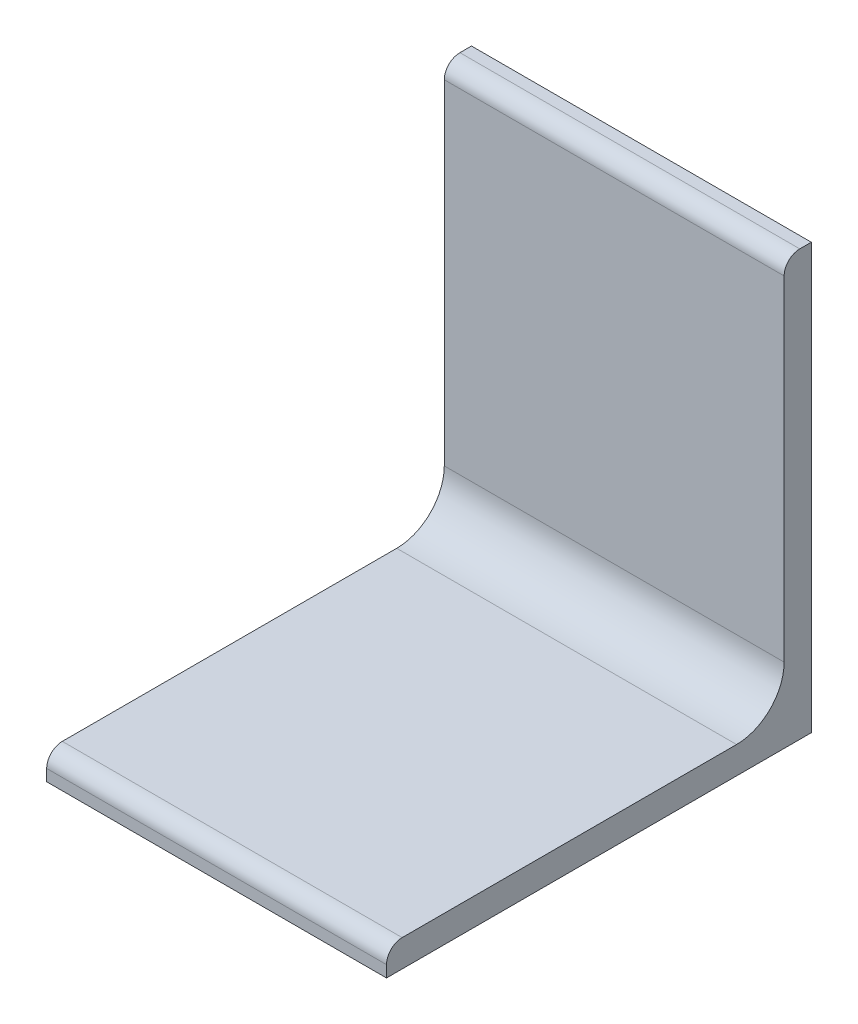
ISO-10303-21;
HEADER;
FILE_DESCRIPTION(('STEP AP214'),'2;1');
FILE_NAME('part.step','',(''),(''),'','','');
FILE_SCHEMA(('AUTOMOTIVE_DESIGN { 1 0 10303 214 1 1 1 1 }'));
ENDSEC;
DATA;
#1=APPLICATION_CONTEXT('core data for automotive mechanical design processes');
#2=APPLICATION_PROTOCOL_DEFINITION('international standard','automotive_design',2000,#1);
#3=PRODUCT_CONTEXT('',#1,'mechanical');
#4=PRODUCT('Part','Part','',(#3));
#5=PRODUCT_RELATED_PRODUCT_CATEGORY('part','',(#4));
#6=PRODUCT_DEFINITION_FORMATION('','',#4);
#7=PRODUCT_DEFINITION_CONTEXT('part definition',#1,'design');
#8=PRODUCT_DEFINITION('design','',#6,#7);
#9=PRODUCT_DEFINITION_SHAPE('','',#8);
#10=(LENGTH_UNIT() NAMED_UNIT(*) SI_UNIT(.MILLI.,.METRE.));
#11=(NAMED_UNIT(*) PLANE_ANGLE_UNIT() SI_UNIT($,.RADIAN.));
#12=(NAMED_UNIT(*) SI_UNIT($,.STERADIAN.) SOLID_ANGLE_UNIT());
#13=UNCERTAINTY_MEASURE_WITH_UNIT(LENGTH_MEASURE(1.E-05),#10,'distance_accuracy_value','');
#14=(GEOMETRIC_REPRESENTATION_CONTEXT(3) GLOBAL_UNCERTAINTY_ASSIGNED_CONTEXT((#13)) GLOBAL_UNIT_ASSIGNED_CONTEXT((#10,
#11,#12)) REPRESENTATION_CONTEXT('',''));
#15=CARTESIAN_POINT('',(0.,0.,0.));
#16=DIRECTION('',(0.,0.,1.));
#17=DIRECTION('',(1.,0.,0.));
#18=AXIS2_PLACEMENT_3D('',#15,#16,#17);
#19=CARTESIAN_POINT('',(100.,91.4,-33.6));
#20=DIRECTION('',(0.,0.,1.));
#21=DIRECTION('',(0.,-1.,0.));
#22=AXIS2_PLACEMENT_3D('',#19,#20,#21);
#23=PLANE('',#22);
#24=DIRECTION('',(0.,1.,0.));
#25=VECTOR('',#24,1.);
#26=CARTESIAN_POINT('',(0.,91.4,-33.6));
#27=LINE('',#26,#25);
#28=CARTESIAN_POINT('',(0.,-33.6,-33.6));
#29=VERTEX_POINT('',#28);
#30=CARTESIAN_POINT('',(0.,91.4,-33.6));
#31=VERTEX_POINT('',#30);
#32=EDGE_CURVE('E168',#29,#31,#27,.T.);
#33=ORIENTED_EDGE('',*,*,#32,.T.);
#34=DIRECTION('',(-1.,0.,0.));
#35=VECTOR('',#34,1.);
#36=CARTESIAN_POINT('',(100.,91.4,-33.6));
#37=LINE('',#36,#35);
#38=CARTESIAN_POINT('',(100.,91.4,-33.6));
#39=VERTEX_POINT('',#38);
#40=EDGE_CURVE('E13',#39,#31,#37,.T.);
#41=ORIENTED_EDGE('',*,*,#40,.F.);
#42=DIRECTION('',(0.,1.,0.));
#43=VECTOR('',#42,1.);
#44=CARTESIAN_POINT('',(100.,91.4,-33.6));
#45=LINE('',#44,#43);
#46=CARTESIAN_POINT('',(100.,-33.6,-33.6));
#47=VERTEX_POINT('',#46);
#48=EDGE_CURVE('E184',#47,#39,#45,.T.);
#49=ORIENTED_EDGE('',*,*,#48,.F.);
#50=DIRECTION('',(-1.,0.,0.));
#51=VECTOR('',#50,1.);
#52=CARTESIAN_POINT('',(100.,-33.6,-33.6));
#53=LINE('',#52,#51);
#54=EDGE_CURVE('E164',#47,#29,#53,.T.);
#55=ORIENTED_EDGE('',*,*,#54,.T.);
#56=EDGE_LOOP('',(#33,#41,#49,#55));
#57=FACE_BOUND('',#56,.T.);
#58=ADVANCED_FACE('F66',(#57),#23,.F.);
#59=CARTESIAN_POINT('',(100.,91.4,-33.6));
#60=DIRECTION('',(0.,-1.,0.));
#61=DIRECTION('',(0.,0.,-1.));
#62=AXIS2_PLACEMENT_3D('',#59,#60,#61);
#63=PLANE('',#62);
#64=DIRECTION('',(0.,0.,1.));
#65=VECTOR('',#64,1.);
#66=CARTESIAN_POINT('',(0.,91.4,-33.6));
#67=LINE('',#66,#65);
#68=CARTESIAN_POINT('',(0.,91.4,-30.2));
#69=VERTEX_POINT('',#68);
#70=EDGE_CURVE('E171',#31,#69,#67,.T.);
#71=ORIENTED_EDGE('',*,*,#70,.T.);
#72=DIRECTION('',(-1.,0.,0.));
#73=VECTOR('',#72,1.);
#74=CARTESIAN_POINT('',(100.,91.4,-30.2));
#75=LINE('',#74,#73);
#76=CARTESIAN_POINT('',(100.,91.4,-30.2));
#77=VERTEX_POINT('',#76);
#78=EDGE_CURVE('E74',#77,#69,#75,.T.);
#79=ORIENTED_EDGE('',*,*,#78,.F.);
#80=DIRECTION('',(0.,0.,1.));
#81=VECTOR('',#80,1.);
#82=CARTESIAN_POINT('',(100.,91.4,-33.6));
#83=LINE('',#82,#81);
#84=EDGE_CURVE('E128',#39,#77,#83,.T.);
#85=ORIENTED_EDGE('',*,*,#84,.F.);
#86=ORIENTED_EDGE('',*,*,#40,.T.);
#87=EDGE_LOOP('',(#71,#79,#85,#86));
#88=FACE_BOUND('',#87,.T.);
#89=ADVANCED_FACE('F227',(#88),#63,.F.);
#90=CARTESIAN_POINT('',(100.,86.8,-30.2));
#91=DIRECTION('',(-1.,0.,0.));
#92=DIRECTION('',(0.,0.,1.));
#93=AXIS2_PLACEMENT_3D('',#90,#91,#92);
#94=CYLINDRICAL_SURFACE('',#93,4.60000000000001);
#95=CARTESIAN_POINT('',(0.,86.8,-30.2));
#96=DIRECTION('',(1.,0.,0.));
#97=DIRECTION('',(0.,0.,1.));
#98=AXIS2_PLACEMENT_3D('',#95,#96,#97);
#99=CIRCLE('',#98,4.60000000000001);
#100=CARTESIAN_POINT('',(0.,86.8,-25.6));
#101=VERTEX_POINT('',#100);
#102=EDGE_CURVE('E173',#69,#101,#99,.T.);
#103=ORIENTED_EDGE('',*,*,#102,.T.);
#104=DIRECTION('',(-1.,0.,0.));
#105=VECTOR('',#104,1.);
#106=CARTESIAN_POINT('',(100.,86.8,-25.6));
#107=LINE('',#106,#105);
#108=CARTESIAN_POINT('',(100.,86.8,-25.6));
#109=VERTEX_POINT('',#108);
#110=EDGE_CURVE('E194',#109,#101,#107,.T.);
#111=ORIENTED_EDGE('',*,*,#110,.F.);
#112=CARTESIAN_POINT('',(100.,86.8,-30.2));
#113=DIRECTION('',(1.,0.,0.));
#114=DIRECTION('',(0.,0.,1.));
#115=AXIS2_PLACEMENT_3D('',#112,#113,#114);
#116=CIRCLE('',#115,4.60000000000001);
#117=EDGE_CURVE('E202',#77,#109,#116,.T.);
#118=ORIENTED_EDGE('',*,*,#117,.F.);
#119=ORIENTED_EDGE('',*,*,#78,.T.);
#120=EDGE_LOOP('',(#103,#111,#118,#119));
#121=FACE_BOUND('',#120,.T.);
#122=ADVANCED_FACE('F200',(#121),#94,.T.);
#123=CARTESIAN_POINT('',(100.,-11.6,-25.6));
#124=DIRECTION('',(0.,0.,-1.));
#125=DIRECTION('',(-1.,0.,0.));
#126=AXIS2_PLACEMENT_3D('',#123,#124,#125);
#127=PLANE('',#126);
#128=DIRECTION('',(0.,-1.,0.));
#129=VECTOR('',#128,1.);
#130=CARTESIAN_POINT('',(0.,-11.6,-25.6));
#131=LINE('',#130,#129);
#132=CARTESIAN_POINT('',(0.,-11.6,-25.6));
#133=VERTEX_POINT('',#132);
#134=EDGE_CURVE('E175',#101,#133,#131,.T.);
#135=ORIENTED_EDGE('',*,*,#134,.T.);
#136=DIRECTION('',(-1.,0.,0.));
#137=VECTOR('',#136,1.);
#138=CARTESIAN_POINT('',(100.,-11.6,-25.6));
#139=LINE('',#138,#137);
#140=CARTESIAN_POINT('',(100.,-11.6,-25.6));
#141=VERTEX_POINT('',#140);
#142=EDGE_CURVE('E191',#141,#133,#139,.T.);
#143=ORIENTED_EDGE('',*,*,#142,.F.);
#144=DIRECTION('',(0.,-1.,0.));
#145=VECTOR('',#144,1.);
#146=CARTESIAN_POINT('',(100.,-11.6,-25.6));
#147=LINE('',#146,#145);
#148=EDGE_CURVE('E218',#109,#141,#147,.T.);
#149=ORIENTED_EDGE('',*,*,#148,.F.);
#150=ORIENTED_EDGE('',*,*,#110,.T.);
#151=EDGE_LOOP('',(#135,#143,#149,#150));
#152=FACE_BOUND('',#151,.T.);
#153=ADVANCED_FACE('F211',(#152),#127,.F.);
#154=CARTESIAN_POINT('',(100.,-11.6,-11.6));
#155=DIRECTION('',(-1.,0.,0.));
#156=DIRECTION('',(0.,0.,1.));
#157=AXIS2_PLACEMENT_3D('',#154,#155,#156);
#158=CYLINDRICAL_SURFACE('',#157,14.);
#159=CARTESIAN_POINT('',(0.,-11.6,-11.6));
#160=DIRECTION('',(-1.,0.,0.));
#161=DIRECTION('',(0.,0.,1.));
#162=AXIS2_PLACEMENT_3D('',#159,#160,#161);
#163=CIRCLE('',#162,14.);
#164=CARTESIAN_POINT('',(0.,-25.6,-11.6));
#165=VERTEX_POINT('',#164);
#166=EDGE_CURVE('E177',#133,#165,#163,.T.);
#167=ORIENTED_EDGE('',*,*,#166,.T.);
#168=DIRECTION('',(-1.,0.,0.));
#169=VECTOR('',#168,1.);
#170=CARTESIAN_POINT('',(100.,-25.6,-11.6));
#171=LINE('',#170,#169);
#172=CARTESIAN_POINT('',(100.,-25.6,-11.6));
#173=VERTEX_POINT('',#172);
#174=EDGE_CURVE('E188',#173,#165,#171,.T.);
#175=ORIENTED_EDGE('',*,*,#174,.F.);
#176=CARTESIAN_POINT('',(100.,-11.6,-11.6));
#177=DIRECTION('',(-1.,0.,0.));
#178=DIRECTION('',(0.,0.,1.));
#179=AXIS2_PLACEMENT_3D('',#176,#177,#178);
#180=CIRCLE('',#179,14.);
#181=EDGE_CURVE('E217',#141,#173,#180,.T.);
#182=ORIENTED_EDGE('',*,*,#181,.F.);
#183=ORIENTED_EDGE('',*,*,#142,.T.);
#184=EDGE_LOOP('',(#167,#175,#182,#183));
#185=FACE_BOUND('',#184,.T.);
#186=ADVANCED_FACE('F215',(#185),#158,.F.);
#187=CARTESIAN_POINT('',(100.,-25.6,86.8));
#188=DIRECTION('',(0.,-1.,0.));
#189=DIRECTION('',(0.,0.,-1.));
#190=AXIS2_PLACEMENT_3D('',#187,#188,#189);
#191=PLANE('',#190);
#192=DIRECTION('',(0.,0.,1.));
#193=VECTOR('',#192,1.);
#194=CARTESIAN_POINT('',(0.,-25.6,86.8));
#195=LINE('',#194,#193);
#196=CARTESIAN_POINT('',(0.,-25.6,86.8));
#197=VERTEX_POINT('',#196);
#198=EDGE_CURVE('E179',#165,#197,#195,.T.);
#199=ORIENTED_EDGE('',*,*,#198,.T.);
#200=DIRECTION('',(-1.,0.,0.));
#201=VECTOR('',#200,1.);
#202=CARTESIAN_POINT('',(100.,-25.6,86.8));
#203=LINE('',#202,#201);
#204=CARTESIAN_POINT('',(100.,-25.6,86.8));
#205=VERTEX_POINT('',#204);
#206=EDGE_CURVE('E159',#205,#197,#203,.T.);
#207=ORIENTED_EDGE('',*,*,#206,.F.);
#208=DIRECTION('',(0.,0.,1.));
#209=VECTOR('',#208,1.);
#210=CARTESIAN_POINT('',(100.,-25.6,86.8));
#211=LINE('',#210,#209);
#212=EDGE_CURVE('E150',#173,#205,#211,.T.);
#213=ORIENTED_EDGE('',*,*,#212,.F.);
#214=ORIENTED_EDGE('',*,*,#174,.T.);
#215=EDGE_LOOP('',(#199,#207,#213,#214));
#216=FACE_BOUND('',#215,.T.);
#217=ADVANCED_FACE('F239',(#216),#191,.F.);
#218=CARTESIAN_POINT('',(100.,-30.2,86.8));
#219=DIRECTION('',(-1.,0.,0.));
#220=DIRECTION('',(0.,0.,1.));
#221=AXIS2_PLACEMENT_3D('',#218,#219,#220);
#222=CYLINDRICAL_SURFACE('',#221,4.6);
#223=CARTESIAN_POINT('',(0.,-30.2,86.8));
#224=DIRECTION('',(1.,0.,0.));
#225=DIRECTION('',(0.,0.,-1.));
#226=AXIS2_PLACEMENT_3D('',#223,#224,#225);
#227=CIRCLE('',#226,4.6);
#228=CARTESIAN_POINT('',(0.,-30.2,91.4));
#229=VERTEX_POINT('',#228);
#230=EDGE_CURVE('E158',#197,#229,#227,.T.);
#231=ORIENTED_EDGE('',*,*,#230,.T.);
#232=DIRECTION('',(-1.,0.,0.));
#233=VECTOR('',#232,1.);
#234=CARTESIAN_POINT('',(100.,-30.2,91.4));
#235=LINE('',#234,#233);
#236=CARTESIAN_POINT('',(100.,-30.2,91.4));
#237=VERTEX_POINT('',#236);
#238=EDGE_CURVE('E155',#237,#229,#235,.T.);
#239=ORIENTED_EDGE('',*,*,#238,.F.);
#240=CARTESIAN_POINT('',(100.,-30.2,86.8));
#241=DIRECTION('',(1.,0.,0.));
#242=DIRECTION('',(0.,0.,-1.));
#243=AXIS2_PLACEMENT_3D('',#240,#241,#242);
#244=CIRCLE('',#243,4.6);
#245=EDGE_CURVE('E144',#205,#237,#244,.T.);
#246=ORIENTED_EDGE('',*,*,#245,.F.);
#247=ORIENTED_EDGE('',*,*,#206,.T.);
#248=EDGE_LOOP('',(#231,#239,#246,#247));
#249=FACE_BOUND('',#248,.T.);
#250=ADVANCED_FACE('F156',(#249),#222,.T.);
#251=CARTESIAN_POINT('',(100.,-33.6,91.4));
#252=DIRECTION('',(0.,0.,-1.));
#253=DIRECTION('',(-1.,0.,0.));
#254=AXIS2_PLACEMENT_3D('',#251,#252,#253);
#255=PLANE('',#254);
#256=DIRECTION('',(0.,-1.,0.));
#257=VECTOR('',#256,1.);
#258=CARTESIAN_POINT('',(0.,-33.6,91.4));
#259=LINE('',#258,#257);
#260=CARTESIAN_POINT('',(0.,-33.6,91.4));
#261=VERTEX_POINT('',#260);
#262=EDGE_CURVE('E114',#229,#261,#259,.T.);
#263=ORIENTED_EDGE('',*,*,#262,.T.);
#264=DIRECTION('',(-1.,0.,0.));
#265=VECTOR('',#264,1.);
#266=CARTESIAN_POINT('',(100.,-33.6,91.4));
#267=LINE('',#266,#265);
#268=CARTESIAN_POINT('',(100.,-33.6,91.4));
#269=VERTEX_POINT('',#268);
#270=EDGE_CURVE('E160',#269,#261,#267,.T.);
#271=ORIENTED_EDGE('',*,*,#270,.F.);
#272=DIRECTION('',(0.,-1.,0.));
#273=VECTOR('',#272,1.);
#274=CARTESIAN_POINT('',(100.,-33.6,91.4));
#275=LINE('',#274,#273);
#276=EDGE_CURVE('E148',#237,#269,#275,.T.);
#277=ORIENTED_EDGE('',*,*,#276,.F.);
#278=ORIENTED_EDGE('',*,*,#238,.T.);
#279=EDGE_LOOP('',(#263,#271,#277,#278));
#280=FACE_BOUND('',#279,.T.);
#281=ADVANCED_FACE('F162',(#280),#255,.F.);
#282=CARTESIAN_POINT('',(100.,-33.6,-33.6));
#283=DIRECTION('',(0.,1.,0.));
#284=DIRECTION('',(0.,0.,1.));
#285=AXIS2_PLACEMENT_3D('',#282,#283,#284);
#286=PLANE('',#285);
#287=DIRECTION('',(0.,0.,-1.));
#288=VECTOR('',#287,1.);
#289=CARTESIAN_POINT('',(0.,-33.6,-33.6));
#290=LINE('',#289,#288);
#291=EDGE_CURVE('E120',#261,#29,#290,.T.);
#292=ORIENTED_EDGE('',*,*,#291,.T.);
#293=ORIENTED_EDGE('',*,*,#54,.F.);
#294=DIRECTION('',(0.,0.,-1.));
#295=VECTOR('',#294,1.);
#296=CARTESIAN_POINT('',(100.,-33.6,-33.6));
#297=LINE('',#296,#295);
#298=EDGE_CURVE('E82',#269,#47,#297,.T.);
#299=ORIENTED_EDGE('',*,*,#298,.F.);
#300=ORIENTED_EDGE('',*,*,#270,.T.);
#301=EDGE_LOOP('',(#292,#293,#299,#300));
#302=FACE_BOUND('',#301,.T.);
#303=ADVANCED_FACE('F247',(#302),#286,.F.);
#304=CARTESIAN_POINT('',(100.,-30.2,86.8));
#305=DIRECTION('',(1.,0.,0.));
#306=DIRECTION('',(0.,0.,-1.));
#307=AXIS2_PLACEMENT_3D('',#304,#305,#306);
#308=PLANE('',#307);
#309=ORIENTED_EDGE('',*,*,#48,.T.);
#310=ORIENTED_EDGE('',*,*,#84,.T.);
#311=ORIENTED_EDGE('',*,*,#117,.T.);
#312=ORIENTED_EDGE('',*,*,#148,.T.);
#313=ORIENTED_EDGE('',*,*,#181,.T.);
#314=ORIENTED_EDGE('',*,*,#212,.T.);
#315=ORIENTED_EDGE('',*,*,#245,.T.);
#316=ORIENTED_EDGE('',*,*,#276,.T.);
#317=ORIENTED_EDGE('',*,*,#298,.T.);
#318=EDGE_LOOP('',(#309,#310,#311,#312,#313,#314,#315,#316,#317));
#319=FACE_BOUND('',#318,.T.);
#320=ADVANCED_FACE('F146',(#319),#308,.T.);
#321=CARTESIAN_POINT('',(0.,-30.2,86.8));
#322=DIRECTION('',(1.,0.,0.));
#323=DIRECTION('',(0.,0.,-1.));
#324=AXIS2_PLACEMENT_3D('',#321,#322,#323);
#325=PLANE('',#324);
#326=ORIENTED_EDGE('',*,*,#32,.F.);
#327=ORIENTED_EDGE('',*,*,#291,.F.);
#328=ORIENTED_EDGE('',*,*,#262,.F.);
#329=ORIENTED_EDGE('',*,*,#230,.F.);
#330=ORIENTED_EDGE('',*,*,#198,.F.);
#331=ORIENTED_EDGE('',*,*,#166,.F.);
#332=ORIENTED_EDGE('',*,*,#134,.F.);
#333=ORIENTED_EDGE('',*,*,#102,.F.);
#334=ORIENTED_EDGE('',*,*,#70,.F.);
#335=EDGE_LOOP('',(#326,#327,#328,#329,#330,#331,#332,#333,#334));
#336=FACE_BOUND('',#335,.T.);
#337=ADVANCED_FACE('F206',(#336),#325,.F.);
#338=CLOSED_SHELL('',(#58,#89,#122,#153,#186,#217,#250,#281,#303,#320,#337));
#339=MANIFOLD_SOLID_BREP('B2',#338);
#340=ADVANCED_BREP_SHAPE_REPRESENTATION('',(#18,#339),#14);
#341=SHAPE_DEFINITION_REPRESENTATION(#9,#340);
ENDSEC;
END-ISO-10303-21;
